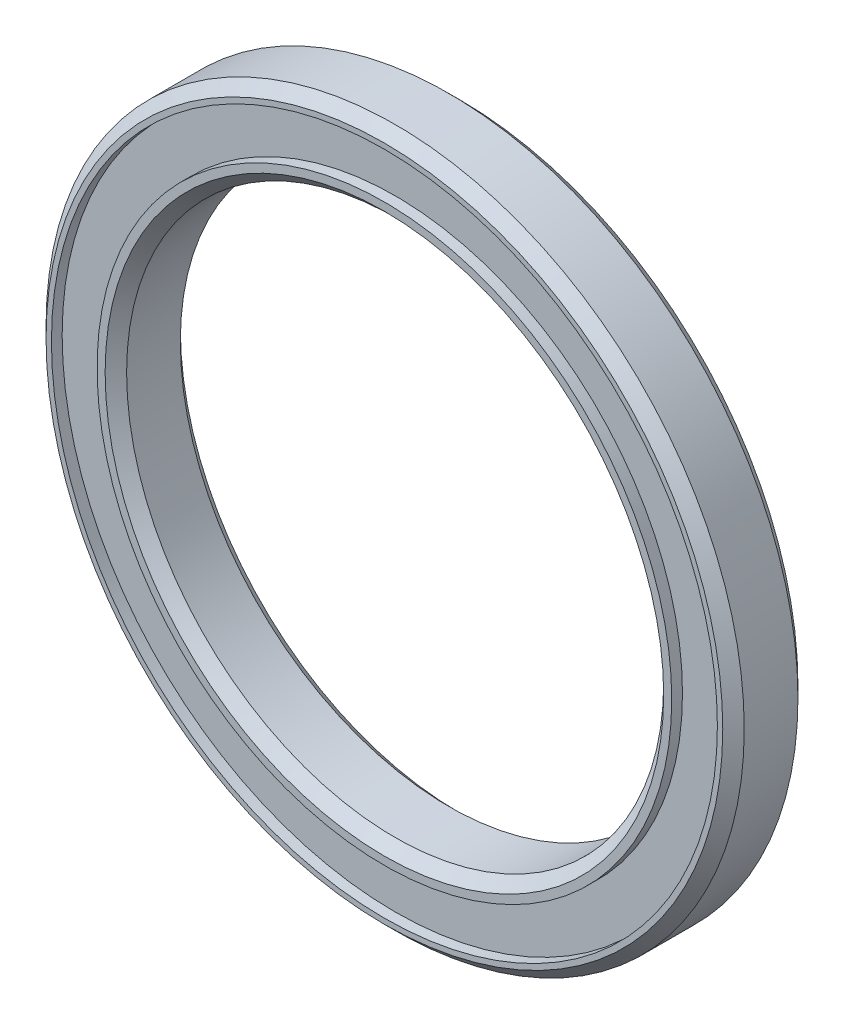
ISO-10303-21;
HEADER;
FILE_DESCRIPTION(('STEP AP214'),'2;1');
FILE_NAME('part.step','',(''),(''),'','','');
FILE_SCHEMA(('AUTOMOTIVE_DESIGN { 1 0 10303 214 1 1 1 1 }'));
ENDSEC;
DATA;
#1=APPLICATION_CONTEXT('core data for automotive mechanical design processes');
#2=APPLICATION_PROTOCOL_DEFINITION('international standard','automotive_design',2000,#1);
#3=PRODUCT_CONTEXT('',#1,'mechanical');
#4=PRODUCT('Part','Part','',(#3));
#5=PRODUCT_RELATED_PRODUCT_CATEGORY('part','',(#4));
#6=PRODUCT_DEFINITION_FORMATION('','',#4);
#7=PRODUCT_DEFINITION_CONTEXT('part definition',#1,'design');
#8=PRODUCT_DEFINITION('design','',#6,#7);
#9=PRODUCT_DEFINITION_SHAPE('','',#8);
#10=(LENGTH_UNIT() NAMED_UNIT(*) SI_UNIT(.MILLI.,.METRE.));
#11=(NAMED_UNIT(*) PLANE_ANGLE_UNIT() SI_UNIT($,.RADIAN.));
#12=(NAMED_UNIT(*) SI_UNIT($,.STERADIAN.) SOLID_ANGLE_UNIT());
#13=UNCERTAINTY_MEASURE_WITH_UNIT(LENGTH_MEASURE(1.E-05),#10,'distance_accuracy_value','');
#14=(GEOMETRIC_REPRESENTATION_CONTEXT(3) GLOBAL_UNCERTAINTY_ASSIGNED_CONTEXT((#13)) GLOBAL_UNIT_ASSIGNED_CONTEXT((#10,
#11,#12)) REPRESENTATION_CONTEXT('',''));
#15=CARTESIAN_POINT('',(0.,0.,0.));
#16=DIRECTION('',(0.,0.,1.));
#17=DIRECTION('',(1.,0.,0.));
#18=AXIS2_PLACEMENT_3D('',#15,#16,#17);
#19=CARTESIAN_POINT('',(0.,0.,-3.5));
#20=DIRECTION('',(0.,0.,1.));
#21=DIRECTION('',(1.,0.,0.));
#22=AXIS2_PLACEMENT_3D('',#19,#20,#21);
#23=PLANE('',#22);
#24=CARTESIAN_POINT('',(0.,0.,-3.5));
#25=DIRECTION('',(0.,0.,1.));
#26=DIRECTION('',(1.,0.,0.));
#27=AXIS2_PLACEMENT_3D('',#24,#25,#26);
#28=CIRCLE('',#27,26.);
#29=CARTESIAN_POINT('',(26.,0.,-3.5));
#30=VERTEX_POINT('',#29);
#31=EDGE_CURVE('E62',#30,#30,#28,.T.);
#32=ORIENTED_EDGE('',*,*,#31,.T.);
#33=EDGE_LOOP('',(#32));
#34=FACE_BOUND('',#33,.T.);
#35=CARTESIAN_POINT('',(0.,0.,-3.5));
#36=DIRECTION('',(0.,0.,1.));
#37=DIRECTION('',(1.,0.,0.));
#38=AXIS2_PLACEMENT_3D('',#35,#36,#37);
#39=CIRCLE('',#38,26.75);
#40=CARTESIAN_POINT('',(26.75,0.,-3.5));
#41=VERTEX_POINT('',#40);
#42=EDGE_CURVE('E84',#41,#41,#39,.T.);
#43=ORIENTED_EDGE('',*,*,#42,.F.);
#44=EDGE_LOOP('',(#43));
#45=FACE_BOUND('',#44,.T.);
#46=ADVANCED_FACE('F33',(#34,#45),#23,.F.);
#47=CARTESIAN_POINT('',(0.,0.,3.5));
#48=DIRECTION('',(0.,0.,1.));
#49=DIRECTION('',(1.,0.,0.));
#50=AXIS2_PLACEMENT_3D('',#47,#48,#49);
#51=PLANE('',#50);
#52=CARTESIAN_POINT('',(0.,0.,3.5));
#53=DIRECTION('',(0.,0.,1.));
#54=DIRECTION('',(1.,0.,0.));
#55=AXIS2_PLACEMENT_3D('',#52,#53,#54);
#56=CIRCLE('',#55,26.);
#57=CARTESIAN_POINT('',(26.,0.,3.5));
#58=VERTEX_POINT('',#57);
#59=EDGE_CURVE('E53',#58,#58,#56,.F.);
#60=ORIENTED_EDGE('',*,*,#59,.T.);
#61=EDGE_LOOP('',(#60));
#62=FACE_BOUND('',#61,.T.);
#63=CARTESIAN_POINT('',(0.,0.,3.5));
#64=DIRECTION('',(0.,0.,1.));
#65=DIRECTION('',(1.,0.,0.));
#66=AXIS2_PLACEMENT_3D('',#63,#64,#65);
#67=CIRCLE('',#66,26.75);
#68=CARTESIAN_POINT('',(26.75,0.,3.5));
#69=VERTEX_POINT('',#68);
#70=EDGE_CURVE('E72',#69,#69,#67,.T.);
#71=ORIENTED_EDGE('',*,*,#70,.T.);
#72=EDGE_LOOP('',(#71));
#73=FACE_BOUND('',#72,.T.);
#74=ADVANCED_FACE('F101',(#62,#73),#51,.T.);
#75=CARTESIAN_POINT('',(0.,0.,3.5));
#76=DIRECTION('',(0.,0.,1.));
#77=DIRECTION('',(1.,0.,0.));
#78=AXIS2_PLACEMENT_3D('',#75,#76,#77);
#79=CIRCLE('',#78,31.5);
#80=CARTESIAN_POINT('',(31.5,0.,3.5));
#81=VERTEX_POINT('',#80);
#82=EDGE_CURVE('E10',#81,#81,#79,.T.);
#83=ORIENTED_EDGE('',*,*,#82,.T.);
#84=EDGE_LOOP('',(#83));
#85=FACE_BOUND('',#84,.T.);
#86=CARTESIAN_POINT('',(0.,0.,3.5));
#87=DIRECTION('',(0.,0.,1.));
#88=DIRECTION('',(1.,0.,0.));
#89=AXIS2_PLACEMENT_3D('',#86,#87,#88);
#90=CIRCLE('',#89,31.);
#91=CARTESIAN_POINT('',(31.,0.,3.5));
#92=VERTEX_POINT('',#91);
#93=EDGE_CURVE('E66',#92,#92,#90,.T.);
#94=ORIENTED_EDGE('',*,*,#93,.F.);
#95=EDGE_LOOP('',(#94));
#96=FACE_BOUND('',#95,.T.);
#97=ADVANCED_FACE('F108',(#85,#96),#51,.T.);
#98=CARTESIAN_POINT('',(0.,0.,-3.5));
#99=DIRECTION('',(0.,0.,1.));
#100=DIRECTION('',(1.,0.,0.));
#101=AXIS2_PLACEMENT_3D('',#98,#99,#100);
#102=CIRCLE('',#101,31.5);
#103=CARTESIAN_POINT('',(31.5,0.,-3.5));
#104=VERTEX_POINT('',#103);
#105=EDGE_CURVE('E40',#104,#104,#102,.F.);
#106=ORIENTED_EDGE('',*,*,#105,.T.);
#107=EDGE_LOOP('',(#106));
#108=FACE_BOUND('',#107,.T.);
#109=CARTESIAN_POINT('',(0.,0.,-3.5));
#110=DIRECTION('',(0.,0.,1.));
#111=DIRECTION('',(1.,0.,0.));
#112=AXIS2_PLACEMENT_3D('',#109,#110,#111);
#113=CIRCLE('',#112,31.);
#114=CARTESIAN_POINT('',(31.,0.,-3.5));
#115=VERTEX_POINT('',#114);
#116=EDGE_CURVE('E78',#115,#115,#113,.T.);
#117=ORIENTED_EDGE('',*,*,#116,.T.);
#118=EDGE_LOOP('',(#117));
#119=FACE_BOUND('',#118,.T.);
#120=ADVANCED_FACE('F104',(#108,#119),#23,.F.);
#121=CARTESIAN_POINT('',(0.,0.,3.5));
#122=DIRECTION('',(0.,0.,-1.));
#123=DIRECTION('',(-1.,0.,0.));
#124=AXIS2_PLACEMENT_3D('',#121,#122,#123);
#125=CYLINDRICAL_SURFACE('',#124,32.5);
#126=CARTESIAN_POINT('',(0.,0.,-2.50000000000001));
#127=DIRECTION('',(0.,0.,1.));
#128=DIRECTION('',(1.,0.,0.));
#129=AXIS2_PLACEMENT_3D('',#126,#127,#128);
#130=CIRCLE('',#129,32.5);
#131=CARTESIAN_POINT('',(32.5,0.,-2.50000000000001));
#132=VERTEX_POINT('',#131);
#133=EDGE_CURVE('E44',#132,#132,#130,.T.);
#134=ORIENTED_EDGE('',*,*,#133,.T.);
#135=EDGE_LOOP('',(#134));
#136=FACE_BOUND('',#135,.T.);
#137=CARTESIAN_POINT('',(0.,0.,2.49999999999999));
#138=DIRECTION('',(0.,0.,1.));
#139=DIRECTION('',(1.,0.,0.));
#140=AXIS2_PLACEMENT_3D('',#137,#138,#139);
#141=CIRCLE('',#140,32.5);
#142=CARTESIAN_POINT('',(32.5,0.,2.49999999999999));
#143=VERTEX_POINT('',#142);
#144=EDGE_CURVE('E48',#143,#143,#141,.F.);
#145=ORIENTED_EDGE('',*,*,#144,.T.);
#146=EDGE_LOOP('',(#145));
#147=FACE_BOUND('',#146,.T.);
#148=ADVANCED_FACE('F113',(#136,#147),#125,.T.);
#149=CARTESIAN_POINT('',(0.,0.,3.5));
#150=DIRECTION('',(0.,0.,-1.));
#151=DIRECTION('',(-1.,0.,0.));
#152=AXIS2_PLACEMENT_3D('',#149,#150,#151);
#153=CYLINDRICAL_SURFACE('',#152,25.);
#154=CARTESIAN_POINT('',(0.,0.,-2.49999999999999));
#155=DIRECTION('',(0.,0.,1.));
#156=DIRECTION('',(1.,0.,0.));
#157=AXIS2_PLACEMENT_3D('',#154,#155,#156);
#158=CIRCLE('',#157,25.);
#159=CARTESIAN_POINT('',(25.,0.,-2.49999999999999));
#160=VERTEX_POINT('',#159);
#161=EDGE_CURVE('E56',#160,#160,#158,.F.);
#162=ORIENTED_EDGE('',*,*,#161,.T.);
#163=EDGE_LOOP('',(#162));
#164=FACE_BOUND('',#163,.T.);
#165=CARTESIAN_POINT('',(0.,0.,2.49999999999999));
#166=DIRECTION('',(0.,0.,1.));
#167=DIRECTION('',(1.,0.,0.));
#168=AXIS2_PLACEMENT_3D('',#165,#166,#167);
#169=CIRCLE('',#168,25.);
#170=CARTESIAN_POINT('',(25.,0.,2.49999999999999));
#171=VERTEX_POINT('',#170);
#172=EDGE_CURVE('E59',#171,#171,#169,.T.);
#173=ORIENTED_EDGE('',*,*,#172,.T.);
#174=EDGE_LOOP('',(#173));
#175=FACE_BOUND('',#174,.T.);
#176=ADVANCED_FACE('F118',(#164,#175),#153,.F.);
#177=CARTESIAN_POINT('',(0.,0.,2.5));
#178=DIRECTION('',(0.,0.,1.));
#179=DIRECTION('',(1.,0.,0.));
#180=AXIS2_PLACEMENT_3D('',#177,#178,#179);
#181=CYLINDRICAL_SURFACE('',#180,31.);
#182=CARTESIAN_POINT('',(0.,0.,2.5));
#183=DIRECTION('',(0.,0.,1.));
#184=DIRECTION('',(1.,0.,0.));
#185=AXIS2_PLACEMENT_3D('',#182,#183,#184);
#186=CIRCLE('',#185,31.);
#187=CARTESIAN_POINT('',(31.,0.,2.5));
#188=VERTEX_POINT('',#187);
#189=EDGE_CURVE('E65',#188,#188,#186,.T.);
#190=ORIENTED_EDGE('',*,*,#189,.F.);
#191=EDGE_LOOP('',(#190));
#192=FACE_BOUND('',#191,.T.);
#193=ORIENTED_EDGE('',*,*,#93,.T.);
#194=EDGE_LOOP('',(#193));
#195=FACE_BOUND('',#194,.T.);
#196=ADVANCED_FACE('F139',(#192,#195),#181,.F.);
#197=CARTESIAN_POINT('',(0.,0.,2.5));
#198=DIRECTION('',(0.,0.,1.));
#199=DIRECTION('',(1.,0.,0.));
#200=AXIS2_PLACEMENT_3D('',#197,#198,#199);
#201=PLANE('',#200);
#202=CARTESIAN_POINT('',(0.,0.,2.5));
#203=DIRECTION('',(0.,0.,1.));
#204=DIRECTION('',(1.,0.,0.));
#205=AXIS2_PLACEMENT_3D('',#202,#203,#204);
#206=CIRCLE('',#205,26.75);
#207=CARTESIAN_POINT('',(26.75,0.,2.5));
#208=VERTEX_POINT('',#207);
#209=EDGE_CURVE('E69',#208,#208,#206,.T.);
#210=ORIENTED_EDGE('',*,*,#209,.F.);
#211=EDGE_LOOP('',(#210));
#212=FACE_BOUND('',#211,.T.);
#213=ORIENTED_EDGE('',*,*,#189,.T.);
#214=EDGE_LOOP('',(#213));
#215=FACE_BOUND('',#214,.T.);
#216=ADVANCED_FACE('F135',(#212,#215),#201,.T.);
#217=CARTESIAN_POINT('',(0.,0.,2.5));
#218=DIRECTION('',(0.,0.,1.));
#219=DIRECTION('',(1.,0.,0.));
#220=AXIS2_PLACEMENT_3D('',#217,#218,#219);
#221=CYLINDRICAL_SURFACE('',#220,26.75);
#222=ORIENTED_EDGE('',*,*,#209,.T.);
#223=EDGE_LOOP('',(#222));
#224=FACE_BOUND('',#223,.T.);
#225=ORIENTED_EDGE('',*,*,#70,.F.);
#226=EDGE_LOOP('',(#225));
#227=FACE_BOUND('',#226,.T.);
#228=ADVANCED_FACE('F129',(#224,#227),#221,.T.);
#229=CARTESIAN_POINT('',(0.,0.,-2.5));
#230=DIRECTION('',(0.,0.,-1.));
#231=DIRECTION('',(1.,0.,0.));
#232=AXIS2_PLACEMENT_3D('',#229,#230,#231);
#233=PLANE('',#232);
#234=CARTESIAN_POINT('',(0.,0.,-2.5));
#235=DIRECTION('',(0.,0.,1.));
#236=DIRECTION('',(1.,0.,0.));
#237=AXIS2_PLACEMENT_3D('',#234,#235,#236);
#238=CIRCLE('',#237,31.);
#239=CARTESIAN_POINT('',(31.,0.,-2.5));
#240=VERTEX_POINT('',#239);
#241=EDGE_CURVE('E75',#240,#240,#238,.T.);
#242=ORIENTED_EDGE('',*,*,#241,.F.);
#243=EDGE_LOOP('',(#242));
#244=FACE_BOUND('',#243,.T.);
#245=CARTESIAN_POINT('',(0.,0.,-2.5));
#246=DIRECTION('',(0.,0.,1.));
#247=DIRECTION('',(1.,0.,0.));
#248=AXIS2_PLACEMENT_3D('',#245,#246,#247);
#249=CIRCLE('',#248,26.75);
#250=CARTESIAN_POINT('',(26.75,0.,-2.5));
#251=VERTEX_POINT('',#250);
#252=EDGE_CURVE('E81',#251,#251,#249,.T.);
#253=ORIENTED_EDGE('',*,*,#252,.T.);
#254=EDGE_LOOP('',(#253));
#255=FACE_BOUND('',#254,.T.);
#256=ADVANCED_FACE('F90',(#244,#255),#233,.T.);
#257=CARTESIAN_POINT('',(0.,0.,-2.5));
#258=DIRECTION('',(0.,0.,-1.));
#259=DIRECTION('',(-1.,0.,0.));
#260=AXIS2_PLACEMENT_3D('',#257,#258,#259);
#261=CYLINDRICAL_SURFACE('',#260,31.);
#262=ORIENTED_EDGE('',*,*,#241,.T.);
#263=EDGE_LOOP('',(#262));
#264=FACE_BOUND('',#263,.T.);
#265=ORIENTED_EDGE('',*,*,#116,.F.);
#266=EDGE_LOOP('',(#265));
#267=FACE_BOUND('',#266,.T.);
#268=ADVANCED_FACE('F96',(#264,#267),#261,.F.);
#269=CARTESIAN_POINT('',(0.,0.,-2.5));
#270=DIRECTION('',(0.,0.,-1.));
#271=DIRECTION('',(-1.,0.,0.));
#272=AXIS2_PLACEMENT_3D('',#269,#270,#271);
#273=CYLINDRICAL_SURFACE('',#272,26.75);
#274=ORIENTED_EDGE('',*,*,#252,.F.);
#275=EDGE_LOOP('',(#274));
#276=FACE_BOUND('',#275,.T.);
#277=ORIENTED_EDGE('',*,*,#42,.T.);
#278=EDGE_LOOP('',(#277));
#279=FACE_BOUND('',#278,.T.);
#280=ADVANCED_FACE('F92',(#276,#279),#273,.T.);
#281=CARTESIAN_POINT('',(0.,0.,-3.5));
#282=DIRECTION('',(0.,0.,-1.));
#283=DIRECTION('',(-1.,0.,0.));
#284=AXIS2_PLACEMENT_3D('',#281,#282,#283);
#285=CONICAL_SURFACE('',#284,26.,0.785398163397443);
#286=ORIENTED_EDGE('',*,*,#161,.F.);
#287=EDGE_LOOP('',(#286));
#288=FACE_BOUND('',#287,.T.);
#289=ORIENTED_EDGE('',*,*,#31,.F.);
#290=EDGE_LOOP('',(#289));
#291=FACE_BOUND('',#290,.T.);
#292=ADVANCED_FACE('F95',(#288,#291),#285,.F.);
#293=CARTESIAN_POINT('',(0.,0.,2.49999999999999));
#294=DIRECTION('',(0.,0.,1.));
#295=DIRECTION('',(1.,0.,0.));
#296=AXIS2_PLACEMENT_3D('',#293,#294,#295);
#297=CONICAL_SURFACE('',#296,25.,0.785398163397447);
#298=ORIENTED_EDGE('',*,*,#59,.F.);
#299=EDGE_LOOP('',(#298));
#300=FACE_BOUND('',#299,.T.);
#301=ORIENTED_EDGE('',*,*,#172,.F.);
#302=EDGE_LOOP('',(#301));
#303=FACE_BOUND('',#302,.T.);
#304=ADVANCED_FACE('F152',(#300,#303),#297,.F.);
#305=CARTESIAN_POINT('',(0.,0.,-2.50000000000001));
#306=DIRECTION('',(0.,0.,1.));
#307=DIRECTION('',(1.,0.,0.));
#308=AXIS2_PLACEMENT_3D('',#305,#306,#307);
#309=CONICAL_SURFACE('',#308,32.5,0.785398163397448);
#310=ORIENTED_EDGE('',*,*,#105,.F.);
#311=EDGE_LOOP('',(#310));
#312=FACE_BOUND('',#311,.T.);
#313=ORIENTED_EDGE('',*,*,#133,.F.);
#314=EDGE_LOOP('',(#313));
#315=FACE_BOUND('',#314,.T.);
#316=ADVANCED_FACE('F154',(#312,#315),#309,.T.);
#317=CARTESIAN_POINT('',(0.,0.,3.5));
#318=DIRECTION('',(0.,0.,-1.));
#319=DIRECTION('',(-1.,0.,0.));
#320=AXIS2_PLACEMENT_3D('',#317,#318,#319);
#321=CONICAL_SURFACE('',#320,31.5,0.785398163397445);
#322=ORIENTED_EDGE('',*,*,#144,.F.);
#323=EDGE_LOOP('',(#322));
#324=FACE_BOUND('',#323,.T.);
#325=ORIENTED_EDGE('',*,*,#82,.F.);
#326=EDGE_LOOP('',(#325));
#327=FACE_BOUND('',#326,.T.);
#328=ADVANCED_FACE('F35',(#324,#327),#321,.T.);
#329=CLOSED_SHELL('',(#46,#74,#97,#120,#148,#176,#196,#216,#228,#256,#268,#280,#292,#304,#316,#328));
#330=MANIFOLD_SOLID_BREP('B2',#329);
#331=ADVANCED_BREP_SHAPE_REPRESENTATION('',(#18,#330),#14);
#332=SHAPE_DEFINITION_REPRESENTATION(#9,#331);
ENDSEC;
END-ISO-10303-21;
